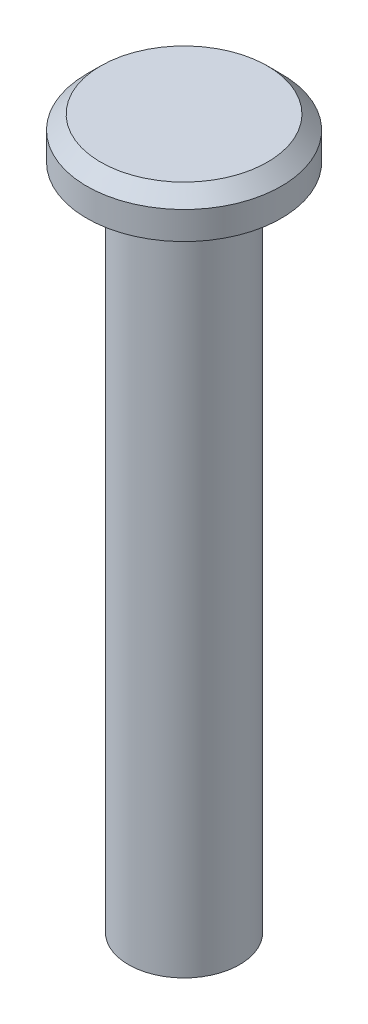
ISO-10303-21;
HEADER;
FILE_DESCRIPTION(('STEP AP214'),'2;1');
FILE_NAME('part.step','',(''),(''),'','','');
FILE_SCHEMA(('AUTOMOTIVE_DESIGN { 1 0 10303 214 1 1 1 1 }'));
ENDSEC;
DATA;
#1=APPLICATION_CONTEXT('core data for automotive mechanical design processes');
#2=APPLICATION_PROTOCOL_DEFINITION('international standard','automotive_design',2000,#1);
#3=PRODUCT_CONTEXT('',#1,'mechanical');
#4=PRODUCT('Part','Part','',(#3));
#5=PRODUCT_RELATED_PRODUCT_CATEGORY('part','',(#4));
#6=PRODUCT_DEFINITION_FORMATION('','',#4);
#7=PRODUCT_DEFINITION_CONTEXT('part definition',#1,'design');
#8=PRODUCT_DEFINITION('design','',#6,#7);
#9=PRODUCT_DEFINITION_SHAPE('','',#8);
#10=(LENGTH_UNIT() NAMED_UNIT(*) SI_UNIT(.MILLI.,.METRE.));
#11=(NAMED_UNIT(*) PLANE_ANGLE_UNIT() SI_UNIT($,.RADIAN.));
#12=(NAMED_UNIT(*) SI_UNIT($,.STERADIAN.) SOLID_ANGLE_UNIT());
#13=UNCERTAINTY_MEASURE_WITH_UNIT(LENGTH_MEASURE(1.E-05),#10,'distance_accuracy_value','');
#14=(GEOMETRIC_REPRESENTATION_CONTEXT(3) GLOBAL_UNCERTAINTY_ASSIGNED_CONTEXT((#13)) GLOBAL_UNIT_ASSIGNED_CONTEXT((#10,
#11,#12)) REPRESENTATION_CONTEXT('',''));
#15=CARTESIAN_POINT('',(0.,0.,0.));
#16=DIRECTION('',(0.,0.,1.));
#17=DIRECTION('',(1.,0.,0.));
#18=AXIS2_PLACEMENT_3D('',#15,#16,#17);
#19=CARTESIAN_POINT('',(0.,0.,0.));
#20=DIRECTION('',(0.,1.,0.));
#21=DIRECTION('',(-1.,0.,0.));
#22=AXIS2_PLACEMENT_3D('',#19,#20,#21);
#23=PLANE('',#22);
#24=CARTESIAN_POINT('',(0.,0.,0.));
#25=DIRECTION('',(0.,1.,0.));
#26=DIRECTION('',(-1.,0.,0.));
#27=AXIS2_PLACEMENT_3D('',#24,#25,#26);
#28=CIRCLE('',#27,4.);
#29=CARTESIAN_POINT('',(-4.,0.,0.));
#30=VERTEX_POINT('',#29);
#31=EDGE_CURVE('E10',#30,#30,#28,.T.);
#32=ORIENTED_EDGE('',*,*,#31,.F.);
#33=EDGE_LOOP('',(#32));
#34=FACE_BOUND('',#33,.T.);
#35=ADVANCED_FACE('F45',(#34),#23,.F.);
#36=CARTESIAN_POINT('',(0.,33.6049720126705,0.));
#37=DIRECTION('',(0.,1.,0.));
#38=DIRECTION('',(-1.,0.,0.));
#39=AXIS2_PLACEMENT_3D('',#36,#37,#38);
#40=CYLINDRICAL_SURFACE('',#39,4.);
#41=CARTESIAN_POINT('',(0.,48.,0.));
#42=DIRECTION('',(0.,1.,0.));
#43=DIRECTION('',(-1.,0.,0.));
#44=AXIS2_PLACEMENT_3D('',#41,#42,#43);
#45=CIRCLE('',#44,4.00000000000001);
#46=CARTESIAN_POINT('',(-4.00000000000001,48.,0.));
#47=VERTEX_POINT('',#46);
#48=EDGE_CURVE('E51',#47,#47,#45,.T.);
#49=ORIENTED_EDGE('',*,*,#48,.F.);
#50=EDGE_LOOP('',(#49));
#51=FACE_BOUND('',#50,.T.);
#52=ORIENTED_EDGE('',*,*,#31,.T.);
#53=EDGE_LOOP('',(#52));
#54=FACE_BOUND('',#53,.T.);
#55=ADVANCED_FACE('F84',(#51,#54),#40,.T.);
#56=CARTESIAN_POINT('',(4.00000000000001,48.,0.));
#57=DIRECTION('',(0.,1.,0.));
#58=DIRECTION('',(-1.,0.,0.));
#59=AXIS2_PLACEMENT_3D('',#56,#57,#58);
#60=PLANE('',#59);
#61=CARTESIAN_POINT('',(0.,48.,0.));
#62=DIRECTION('',(0.,1.,0.));
#63=DIRECTION('',(-1.,0.,0.));
#64=AXIS2_PLACEMENT_3D('',#61,#62,#63);
#65=CIRCLE('',#64,7.);
#66=CARTESIAN_POINT('',(-7.,48.,0.));
#67=VERTEX_POINT('',#66);
#68=EDGE_CURVE('E55',#67,#67,#65,.T.);
#69=ORIENTED_EDGE('',*,*,#68,.F.);
#70=EDGE_LOOP('',(#69));
#71=FACE_BOUND('',#70,.T.);
#72=ORIENTED_EDGE('',*,*,#48,.T.);
#73=EDGE_LOOP('',(#72));
#74=FACE_BOUND('',#73,.T.);
#75=ADVANCED_FACE('F79',(#71,#74),#60,.F.);
#76=CARTESIAN_POINT('',(0.,33.6049720126705,0.));
#77=DIRECTION('',(0.,1.,0.));
#78=DIRECTION('',(-1.,0.,0.));
#79=AXIS2_PLACEMENT_3D('',#76,#77,#78);
#80=CYLINDRICAL_SURFACE('',#79,7.);
#81=CARTESIAN_POINT('',(0.,50.,0.));
#82=DIRECTION('',(0.,1.,0.));
#83=DIRECTION('',(-1.,0.,0.));
#84=AXIS2_PLACEMENT_3D('',#81,#82,#83);
#85=CIRCLE('',#84,7.);
#86=CARTESIAN_POINT('',(-7.,50.,0.));
#87=VERTEX_POINT('',#86);
#88=EDGE_CURVE('E59',#87,#87,#85,.T.);
#89=ORIENTED_EDGE('',*,*,#88,.F.);
#90=EDGE_LOOP('',(#89));
#91=FACE_BOUND('',#90,.T.);
#92=ORIENTED_EDGE('',*,*,#68,.T.);
#93=EDGE_LOOP('',(#92));
#94=FACE_BOUND('',#93,.T.);
#95=ADVANCED_FACE('F73',(#91,#94),#80,.T.);
#96=CARTESIAN_POINT('',(0.,50.,0.));
#97=DIRECTION('',(0.,-1.,0.));
#98=DIRECTION('',(1.,0.,0.));
#99=AXIS2_PLACEMENT_3D('',#96,#97,#98);
#100=CONICAL_SURFACE('',#99,7.,0.785398163397448);
#101=CARTESIAN_POINT('',(0.,51.,0.));
#102=DIRECTION('',(0.,1.,0.));
#103=DIRECTION('',(-1.,0.,0.));
#104=AXIS2_PLACEMENT_3D('',#101,#102,#103);
#105=CIRCLE('',#104,6.);
#106=CARTESIAN_POINT('',(-6.,51.,0.));
#107=VERTEX_POINT('',#106);
#108=EDGE_CURVE('E64',#107,#107,#105,.T.);
#109=ORIENTED_EDGE('',*,*,#108,.F.);
#110=EDGE_LOOP('',(#109));
#111=FACE_BOUND('',#110,.T.);
#112=ORIENTED_EDGE('',*,*,#88,.T.);
#113=EDGE_LOOP('',(#112));
#114=FACE_BOUND('',#113,.T.);
#115=ADVANCED_FACE('F70',(#111,#114),#100,.T.);
#116=CARTESIAN_POINT('',(6.,51.,0.));
#117=DIRECTION('',(0.,-1.,0.));
#118=DIRECTION('',(1.,0.,0.));
#119=AXIS2_PLACEMENT_3D('',#116,#117,#118);
#120=PLANE('',#119);
#121=ORIENTED_EDGE('',*,*,#108,.T.);
#122=EDGE_LOOP('',(#121));
#123=FACE_BOUND('',#122,.T.);
#124=ADVANCED_FACE('F68',(#123),#120,.F.);
#125=CLOSED_SHELL('',(#35,#55,#75,#95,#115,#124));
#126=MANIFOLD_SOLID_BREP('B2',#125);
#127=ADVANCED_BREP_SHAPE_REPRESENTATION('',(#18,#126),#14);
#128=SHAPE_DEFINITION_REPRESENTATION(#9,#127);
ENDSEC;
END-ISO-10303-21;
